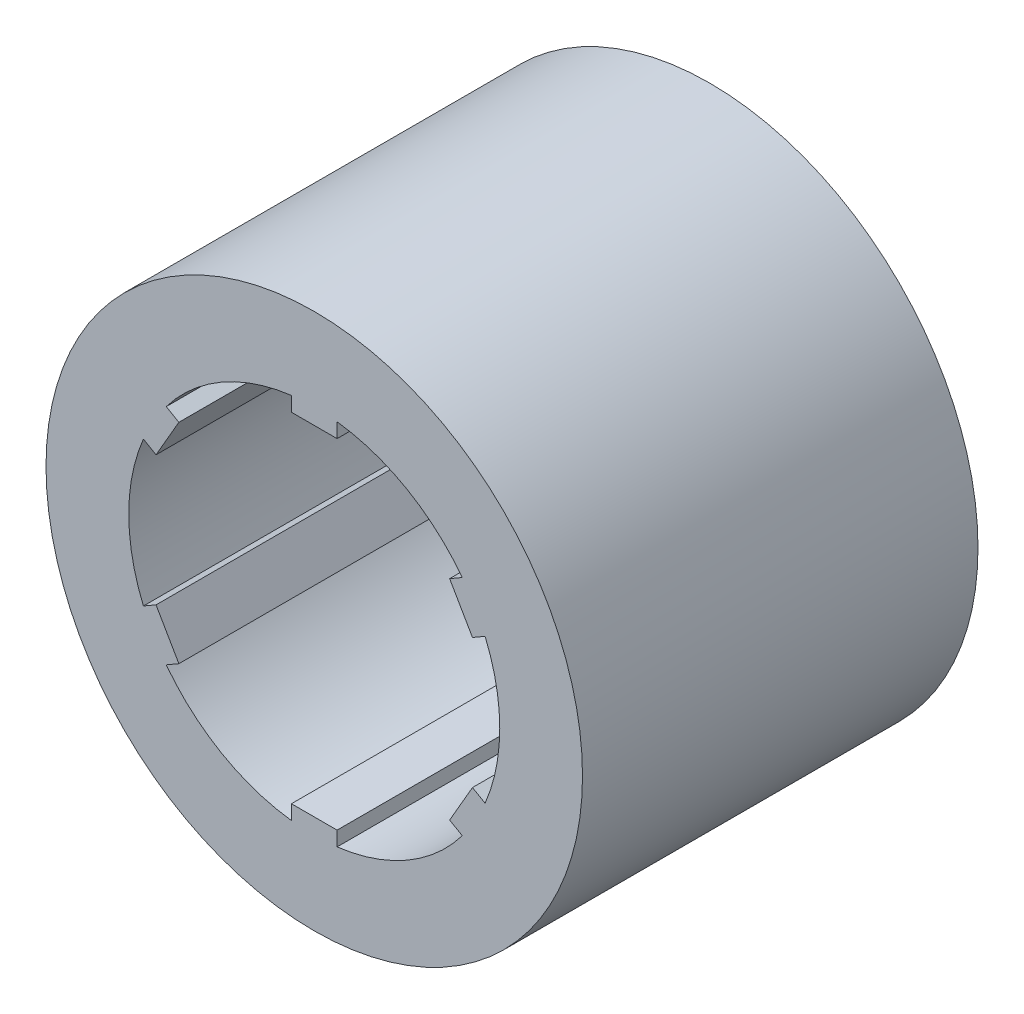
ISO-10303-21;
HEADER;
FILE_DESCRIPTION(('STEP AP214'),'2;1');
FILE_NAME('part.step','',(''),(''),'','','');
FILE_SCHEMA(('AUTOMOTIVE_DESIGN { 1 0 10303 214 1 1 1 1 }'));
ENDSEC;
DATA;
#1=APPLICATION_CONTEXT('core data for automotive mechanical design processes');
#2=APPLICATION_PROTOCOL_DEFINITION('international standard','automotive_design',2000,#1);
#3=PRODUCT_CONTEXT('',#1,'mechanical');
#4=PRODUCT('Part','Part','',(#3));
#5=PRODUCT_RELATED_PRODUCT_CATEGORY('part','',(#4));
#6=PRODUCT_DEFINITION_FORMATION('','',#4);
#7=PRODUCT_DEFINITION_CONTEXT('part definition',#1,'design');
#8=PRODUCT_DEFINITION('design','',#6,#7);
#9=PRODUCT_DEFINITION_SHAPE('','',#8);
#10=(LENGTH_UNIT() NAMED_UNIT(*) SI_UNIT(.MILLI.,.METRE.));
#11=(NAMED_UNIT(*) PLANE_ANGLE_UNIT() SI_UNIT($,.RADIAN.));
#12=(NAMED_UNIT(*) SI_UNIT($,.STERADIAN.) SOLID_ANGLE_UNIT());
#13=UNCERTAINTY_MEASURE_WITH_UNIT(LENGTH_MEASURE(1.E-05),#10,'distance_accuracy_value','');
#14=(GEOMETRIC_REPRESENTATION_CONTEXT(3) GLOBAL_UNCERTAINTY_ASSIGNED_CONTEXT((#13)) GLOBAL_UNIT_ASSIGNED_CONTEXT((#10,
#11,#12)) REPRESENTATION_CONTEXT('',''));
#15=CARTESIAN_POINT('',(0.,0.,0.));
#16=DIRECTION('',(0.,0.,1.));
#17=DIRECTION('',(1.,0.,0.));
#18=AXIS2_PLACEMENT_3D('',#15,#16,#17);
#19=CARTESIAN_POINT('',(0.267491680232823,-0.401237520349207,22.));
#20=DIRECTION('',(0.,0.,1.));
#21=DIRECTION('',(1.,0.,0.));
#22=AXIS2_PLACEMENT_3D('',#19,#20,#21);
#23=PLANE('',#22);
#24=CARTESIAN_POINT('',(0.267491680232823,-0.401237520349207,22.));
#25=DIRECTION('',(0.,0.,1.));
#26=DIRECTION('',(1.,0.,0.));
#27=AXIS2_PLACEMENT_3D('',#24,#25,#26);
#28=CIRCLE('',#27,14.9225);
#29=CARTESIAN_POINT('',(15.1899916802328,-0.401237520349207,22.));
#30=VERTEX_POINT('',#29);
#31=EDGE_CURVE('E11',#30,#30,#28,.T.);
#32=ORIENTED_EDGE('',*,*,#31,.T.);
#33=EDGE_LOOP('',(#32));
#34=FACE_BOUND('',#33,.T.);
#35=DIRECTION('',(0.866025403784438,-0.500000000000001,0.));
#36=VECTOR('',#35,1.);
#37=CARTESIAN_POINT('',(9.06889471596868,-4.01626025894532,22.));
#38=LINE('',#37,#36);
#39=CARTESIAN_POINT('',(9.06889471596868,-4.01626025894532,22.));
#40=VERTEX_POINT('',#39);
#41=CARTESIAN_POINT('',(9.77084980849768,-4.42153422057596,22.));
#42=VERTEX_POINT('',#41);
#43=EDGE_CURVE('E206',#40,#42,#38,.T.);
#44=ORIENTED_EDGE('',*,*,#43,.F.);
#45=DIRECTION('',(0.5,0.866025403784439,0.));
#46=VECTOR('',#45,1.);
#47=CARTESIAN_POINT('',(7.79889472013101,-6.21596477734844,22.));
#48=LINE('',#47,#46);
#49=CARTESIAN_POINT('',(7.79889472013101,-6.21596477734844,22.));
#50=VERTEX_POINT('',#49);
#51=EDGE_CURVE('E198',#50,#40,#48,.T.);
#52=ORIENTED_EDGE('',*,*,#51,.F.);
#53=DIRECTION('',(-0.866025403784439,0.5,0.));
#54=VECTOR('',#53,1.);
#55=CARTESIAN_POINT('',(8.50084981781817,-6.62123874195715,22.));
#56=LINE('',#55,#54);
#57=CARTESIAN_POINT('',(8.50084981781816,-6.62123874195715,22.));
#58=VERTEX_POINT('',#57);
#59=EDGE_CURVE('E262',#58,#50,#56,.T.);
#60=ORIENTED_EDGE('',*,*,#59,.F.);
#61=CARTESIAN_POINT('',(0.267491672147195,-0.401237515003277,22.));
#62=DIRECTION('',(0.,0.,1.));
#63=DIRECTION('',(1.,0.,0.));
#64=AXIS2_PLACEMENT_3D('',#61,#62,#63);
#65=CIRCLE('',#64,10.3187500026987);
#66=CARTESIAN_POINT('',(1.53749167181505,-10.6415354412864,22.));
#67=VERTEX_POINT('',#66);
#68=EDGE_CURVE('E260',#67,#58,#65,.T.);
#69=ORIENTED_EDGE('',*,*,#68,.F.);
#70=DIRECTION('',(0.,-1.,0.));
#71=VECTOR('',#70,1.);
#72=CARTESIAN_POINT('',(1.53749167181505,-9.83098751232511,22.));
#73=LINE('',#72,#71);
#74=CARTESIAN_POINT('',(1.53749167181505,-9.83098751232511,22.));
#75=VERTEX_POINT('',#74);
#76=EDGE_CURVE('E258',#75,#67,#73,.T.);
#77=ORIENTED_EDGE('',*,*,#76,.F.);
#78=DIRECTION('',(1.,0.,0.));
#79=VECTOR('',#78,1.);
#80=CARTESIAN_POINT('',(-1.00250832818495,-9.83098751232511,22.));
#81=LINE('',#80,#79);
#82=CARTESIAN_POINT('',(-1.00250832818495,-9.83098751232511,22.));
#83=VERTEX_POINT('',#82);
#84=EDGE_CURVE('E256',#83,#75,#81,.T.);
#85=ORIENTED_EDGE('',*,*,#84,.F.);
#86=DIRECTION('',(0.,1.,0.));
#87=VECTOR('',#86,1.);
#88=CARTESIAN_POINT('',(-1.00250832818495,-10.641535435592,22.));
#89=LINE('',#88,#87);
#90=CARTESIAN_POINT('',(-1.00250832818496,-10.641535435592,22.));
#91=VERTEX_POINT('',#90);
#92=EDGE_CURVE('E254',#91,#83,#89,.T.);
#93=ORIENTED_EDGE('',*,*,#92,.F.);
#94=CARTESIAN_POINT('',(0.267491673620952,-0.401237514386595,22.));
#95=DIRECTION('',(0.,0.,1.));
#96=DIRECTION('',(1.,0.,0.));
#97=AXIS2_PLACEMENT_3D('',#94,#95,#96);
#98=CIRCLE('',#97,10.3187499979227);
#99=CARTESIAN_POINT('',(-7.96586646486205,-6.62123874293196,22.));
#100=VERTEX_POINT('',#99);
#101=EDGE_CURVE('E252',#100,#91,#98,.T.);
#102=ORIENTED_EDGE('',*,*,#101,.F.);
#103=DIRECTION('',(-0.866025403784438,-0.5,0.));
#104=VECTOR('',#103,1.);
#105=CARTESIAN_POINT('',(-7.26391137134267,-6.21596478072952,22.));
#106=LINE('',#105,#104);
#107=CARTESIAN_POINT('',(-7.26391137134267,-6.21596478072952,22.));
#108=VERTEX_POINT('',#107);
#109=EDGE_CURVE('E250',#108,#100,#106,.T.);
#110=ORIENTED_EDGE('',*,*,#109,.F.);
#111=DIRECTION('',(0.5,-0.866025403784438,0.));
#112=VECTOR('',#111,1.);
#113=CARTESIAN_POINT('',(-8.53391136718035,-4.0162602623264,22.));
#114=LINE('',#113,#112);
#115=CARTESIAN_POINT('',(-8.53391136718035,-4.0162602623264,22.));
#116=VERTEX_POINT('',#115);
#117=EDGE_CURVE('E248',#116,#108,#114,.T.);
#118=ORIENTED_EDGE('',*,*,#117,.F.);
#119=DIRECTION('',(0.866025403784439,0.5,0.));
#120=VECTOR('',#119,1.);
#121=CARTESIAN_POINT('',(-9.23586646146228,-4.42153422496909,22.));
#122=LINE('',#121,#120);
#123=CARTESIAN_POINT('',(-9.23586646146228,-4.42153422496909,22.));
#124=VERTEX_POINT('',#123);
#125=EDGE_CURVE('E246',#124,#116,#122,.T.);
#126=ORIENTED_EDGE('',*,*,#125,.F.);
#127=CARTESIAN_POINT('',(0.267491678842295,-0.401237520937456,22.));
#128=DIRECTION('',(0.,0.,1.));
#129=DIRECTION('',(1.,0.,0.));
#130=AXIS2_PLACEMENT_3D('',#127,#128,#129);
#131=CIRCLE('',#130,10.3187499984902);
#132=CARTESIAN_POINT('',(-9.23586645838339,3.6190591903722,22.));
#133=VERTEX_POINT('',#132);
#134=EDGE_CURVE('E244',#133,#124,#131,.T.);
#135=ORIENTED_EDGE('',*,*,#134,.F.);
#136=DIRECTION('',(-0.866025403784439,0.5,0.));
#137=VECTOR('',#136,1.);
#138=CARTESIAN_POINT('',(-8.53391136585439,3.21378522874155,22.));
#139=LINE('',#138,#137);
#140=CARTESIAN_POINT('',(-8.53391136585439,3.21378522874155,22.));
#141=VERTEX_POINT('',#140);
#142=EDGE_CURVE('E242',#141,#133,#139,.T.);
#143=ORIENTED_EDGE('',*,*,#142,.F.);
#144=DIRECTION('',(-0.5,-0.866025403784439,0.));
#145=VECTOR('',#144,1.);
#146=CARTESIAN_POINT('',(-7.26391137001671,5.41348974714467,22.));
#147=LINE('',#146,#145);
#148=CARTESIAN_POINT('',(-7.26391137001671,5.41348974714467,22.));
#149=VERTEX_POINT('',#148);
#150=EDGE_CURVE('E240',#149,#141,#147,.T.);
#151=ORIENTED_EDGE('',*,*,#150,.F.);
#152=DIRECTION('',(0.866025403784439,-0.499999999999999,0.));
#153=VECTOR('',#152,1.);
#154=CARTESIAN_POINT('',(-7.96586646737953,5.81876371156613,22.));
#155=LINE('',#154,#153);
#156=CARTESIAN_POINT('',(-7.96586646737953,5.81876371156613,22.));
#157=VERTEX_POINT('',#156);
#158=EDGE_CURVE('E238',#157,#149,#155,.T.);
#159=ORIENTED_EDGE('',*,*,#158,.F.);
#160=CARTESIAN_POINT('',(0.267491676457188,-0.401237517815734,22.));
#161=DIRECTION('',(0.,0.,1.));
#162=DIRECTION('',(1.,0.,0.));
#163=AXIS2_PLACEMENT_3D('',#160,#161,#162);
#164=CIRCLE('',#163,10.3187500026987);
#165=CARTESIAN_POINT('',(-1.00250832321067,9.83906040846736,22.));
#166=VERTEX_POINT('',#165);
#167=EDGE_CURVE('E236',#166,#157,#164,.T.);
#168=ORIENTED_EDGE('',*,*,#167,.F.);
#169=DIRECTION('',(0.,1.,0.));
#170=VECTOR('',#169,1.);
#171=CARTESIAN_POINT('',(-1.00250832321067,9.0285124795061,22.));
#172=LINE('',#171,#170);
#173=CARTESIAN_POINT('',(-1.00250832321067,9.0285124795061,22.));
#174=VERTEX_POINT('',#173);
#175=EDGE_CURVE('E234',#174,#166,#172,.T.);
#176=ORIENTED_EDGE('',*,*,#175,.F.);
#177=DIRECTION('',(-1.,0.,0.));
#178=VECTOR('',#177,1.);
#179=CARTESIAN_POINT('',(1.53749167678933,9.0285124795061,22.));
#180=LINE('',#179,#178);
#181=CARTESIAN_POINT('',(1.53749167678933,9.0285124795061,22.));
#182=VERTEX_POINT('',#181);
#183=EDGE_CURVE('E232',#182,#174,#180,.T.);
#184=ORIENTED_EDGE('',*,*,#183,.F.);
#185=DIRECTION('',(0.,-1.,0.));
#186=VECTOR('',#185,1.);
#187=CARTESIAN_POINT('',(1.53749167678933,9.83906040303344,22.));
#188=LINE('',#187,#186);
#189=CARTESIAN_POINT('',(1.53749167678933,9.83906040303344,22.));
#190=VERTEX_POINT('',#189);
#191=EDGE_CURVE('E230',#190,#182,#188,.T.);
#192=ORIENTED_EDGE('',*,*,#191,.F.);
#193=CARTESIAN_POINT('',(0.267491677083749,-0.401237518432414,22.));
#194=DIRECTION('',(0.,0.,1.));
#195=DIRECTION('',(1.,0.,0.));
#196=AXIS2_PLACEMENT_3D('',#193,#194,#195);
#197=CIRCLE('',#196,10.3187499979227);
#198=CARTESIAN_POINT('',(8.50084981556675,5.81876371011295,22.));
#199=VERTEX_POINT('',#198);
#200=EDGE_CURVE('E228',#199,#190,#197,.T.);
#201=ORIENTED_EDGE('',*,*,#200,.F.);
#202=DIRECTION('',(0.866025403784439,0.5,0.));
#203=VECTOR('',#202,1.);
#204=CARTESIAN_POINT('',(7.79889472204737,5.4134897479105,22.));
#205=LINE('',#204,#203);
#206=CARTESIAN_POINT('',(7.79889472204737,5.4134897479105,22.));
#207=VERTEX_POINT('',#206);
#208=EDGE_CURVE('E226',#207,#199,#205,.T.);
#209=ORIENTED_EDGE('',*,*,#208,.F.);
#210=DIRECTION('',(-0.5,0.866025403784438,0.));
#211=VECTOR('',#210,1.);
#212=CARTESIAN_POINT('',(9.06889471555486,3.2137852335434,22.));
#213=LINE('',#212,#211);
#214=CARTESIAN_POINT('',(9.06889471555486,3.2137852335434,22.));
#215=VERTEX_POINT('',#214);
#216=EDGE_CURVE('E224',#215,#207,#213,.T.);
#217=ORIENTED_EDGE('',*,*,#216,.F.);
#218=DIRECTION('',(-0.866025403784439,-0.5,0.));
#219=VECTOR('',#218,1.);
#220=CARTESIAN_POINT('',(9.770849810752,3.61905919671449,22.));
#221=LINE('',#220,#219);
#222=CARTESIAN_POINT('',(9.770849810752,3.61905919671449,22.));
#223=VERTEX_POINT('',#222);
#224=EDGE_CURVE('E220',#223,#215,#221,.T.);
#225=ORIENTED_EDGE('',*,*,#224,.F.);
#226=CARTESIAN_POINT('',(0.267491671272001,-0.401237509266309,22.));
#227=DIRECTION('',(0.,0.,1.));
#228=DIRECTION('',(1.,0.,0.));
#229=AXIS2_PLACEMENT_3D('',#226,#227,#228);
#230=CIRCLE('',#229,10.3187499984902);
#231=EDGE_CURVE('E218',#42,#223,#230,.T.);
#232=ORIENTED_EDGE('',*,*,#231,.F.);
#233=EDGE_LOOP('',(#44,#52,#60,#69,#77,#85,#93,#102,#110,#118,#126,#135,#143,#151,#159,#168,
#176,#184,#192,#201,#209,#217,#225,#232));
#234=FACE_BOUND('',#233,.T.);
#235=ADVANCED_FACE('F37',(#34,#234),#23,.T.);
#236=CARTESIAN_POINT('',(0.267491680232823,-0.401237520349207,0.));
#237=DIRECTION('',(0.,0.,1.));
#238=DIRECTION('',(1.,0.,0.));
#239=AXIS2_PLACEMENT_3D('',#236,#237,#238);
#240=PLANE('',#239);
#241=CARTESIAN_POINT('',(0.267491680232823,-0.401237520349207,0.));
#242=DIRECTION('',(0.,0.,1.));
#243=DIRECTION('',(1.,0.,0.));
#244=AXIS2_PLACEMENT_3D('',#241,#242,#243);
#245=CIRCLE('',#244,14.9225);
#246=CARTESIAN_POINT('',(15.1899916802328,-0.401237520349207,0.));
#247=VERTEX_POINT('',#246);
#248=EDGE_CURVE('E41',#247,#247,#245,.T.);
#249=ORIENTED_EDGE('',*,*,#248,.F.);
#250=EDGE_LOOP('',(#249));
#251=FACE_BOUND('',#250,.T.);
#252=DIRECTION('',(0.5,0.866025403784439,0.));
#253=VECTOR('',#252,1.);
#254=CARTESIAN_POINT('',(7.79889472013101,-6.21596477734844,0.));
#255=LINE('',#254,#253);
#256=CARTESIAN_POINT('',(7.79889472013101,-6.21596477734844,0.));
#257=VERTEX_POINT('',#256);
#258=CARTESIAN_POINT('',(9.06889471596868,-4.01626025894532,0.));
#259=VERTEX_POINT('',#258);
#260=EDGE_CURVE('E60',#257,#259,#255,.T.);
#261=ORIENTED_EDGE('',*,*,#260,.T.);
#262=DIRECTION('',(0.866025403784438,-0.500000000000001,0.));
#263=VECTOR('',#262,1.);
#264=CARTESIAN_POINT('',(9.06889471596868,-4.01626025894532,0.));
#265=LINE('',#264,#263);
#266=CARTESIAN_POINT('',(9.77084980849768,-4.42153422057596,0.));
#267=VERTEX_POINT('',#266);
#268=EDGE_CURVE('E213',#259,#267,#265,.T.);
#269=ORIENTED_EDGE('',*,*,#268,.T.);
#270=CARTESIAN_POINT('',(0.267491671272001,-0.401237509266309,0.));
#271=DIRECTION('',(0.,0.,1.));
#272=DIRECTION('',(1.,0.,0.));
#273=AXIS2_PLACEMENT_3D('',#270,#271,#272);
#274=CIRCLE('',#273,10.3187499984902);
#275=CARTESIAN_POINT('',(9.770849810752,3.61905919671449,0.));
#276=VERTEX_POINT('',#275);
#277=EDGE_CURVE('E266',#267,#276,#274,.T.);
#278=ORIENTED_EDGE('',*,*,#277,.T.);
#279=DIRECTION('',(-0.866025403784439,-0.5,0.));
#280=VECTOR('',#279,1.);
#281=CARTESIAN_POINT('',(9.770849810752,3.61905919671449,0.));
#282=LINE('',#281,#280);
#283=CARTESIAN_POINT('',(9.06889471555486,3.2137852335434,0.));
#284=VERTEX_POINT('',#283);
#285=EDGE_CURVE('E269',#276,#284,#282,.T.);
#286=ORIENTED_EDGE('',*,*,#285,.T.);
#287=DIRECTION('',(-0.5,0.866025403784438,0.));
#288=VECTOR('',#287,1.);
#289=CARTESIAN_POINT('',(9.06889471555486,3.2137852335434,0.));
#290=LINE('',#289,#288);
#291=CARTESIAN_POINT('',(7.79889472204737,5.4134897479105,0.));
#292=VERTEX_POINT('',#291);
#293=EDGE_CURVE('E272',#284,#292,#290,.T.);
#294=ORIENTED_EDGE('',*,*,#293,.T.);
#295=DIRECTION('',(0.866025403784439,0.5,0.));
#296=VECTOR('',#295,1.);
#297=CARTESIAN_POINT('',(7.79889472204737,5.4134897479105,0.));
#298=LINE('',#297,#296);
#299=CARTESIAN_POINT('',(8.50084981556675,5.81876371011295,0.));
#300=VERTEX_POINT('',#299);
#301=EDGE_CURVE('E275',#292,#300,#298,.T.);
#302=ORIENTED_EDGE('',*,*,#301,.T.);
#303=CARTESIAN_POINT('',(0.267491677083749,-0.401237518432414,0.));
#304=DIRECTION('',(0.,0.,1.));
#305=DIRECTION('',(1.,0.,0.));
#306=AXIS2_PLACEMENT_3D('',#303,#304,#305);
#307=CIRCLE('',#306,10.3187499979227);
#308=CARTESIAN_POINT('',(1.53749167678933,9.83906040303344,0.));
#309=VERTEX_POINT('',#308);
#310=EDGE_CURVE('E278',#300,#309,#307,.T.);
#311=ORIENTED_EDGE('',*,*,#310,.T.);
#312=DIRECTION('',(0.,-1.,0.));
#313=VECTOR('',#312,1.);
#314=CARTESIAN_POINT('',(1.53749167678933,9.83906040303344,0.));
#315=LINE('',#314,#313);
#316=CARTESIAN_POINT('',(1.53749167678933,9.0285124795061,0.));
#317=VERTEX_POINT('',#316);
#318=EDGE_CURVE('E281',#309,#317,#315,.T.);
#319=ORIENTED_EDGE('',*,*,#318,.T.);
#320=DIRECTION('',(-1.,0.,0.));
#321=VECTOR('',#320,1.);
#322=CARTESIAN_POINT('',(1.53749167678933,9.0285124795061,0.));
#323=LINE('',#322,#321);
#324=CARTESIAN_POINT('',(-1.00250832321067,9.0285124795061,0.));
#325=VERTEX_POINT('',#324);
#326=EDGE_CURVE('E284',#317,#325,#323,.T.);
#327=ORIENTED_EDGE('',*,*,#326,.T.);
#328=DIRECTION('',(0.,1.,0.));
#329=VECTOR('',#328,1.);
#330=CARTESIAN_POINT('',(-1.00250832321067,9.0285124795061,0.));
#331=LINE('',#330,#329);
#332=CARTESIAN_POINT('',(-1.00250832321067,9.83906040846736,0.));
#333=VERTEX_POINT('',#332);
#334=EDGE_CURVE('E287',#325,#333,#331,.T.);
#335=ORIENTED_EDGE('',*,*,#334,.T.);
#336=CARTESIAN_POINT('',(0.267491676457188,-0.401237517815734,0.));
#337=DIRECTION('',(0.,0.,1.));
#338=DIRECTION('',(1.,0.,0.));
#339=AXIS2_PLACEMENT_3D('',#336,#337,#338);
#340=CIRCLE('',#339,10.3187500026987);
#341=CARTESIAN_POINT('',(-7.96586646737953,5.81876371156613,0.));
#342=VERTEX_POINT('',#341);
#343=EDGE_CURVE('E290',#333,#342,#340,.T.);
#344=ORIENTED_EDGE('',*,*,#343,.T.);
#345=DIRECTION('',(0.866025403784439,-0.499999999999999,0.));
#346=VECTOR('',#345,1.);
#347=CARTESIAN_POINT('',(-7.96586646737953,5.81876371156613,0.));
#348=LINE('',#347,#346);
#349=CARTESIAN_POINT('',(-7.26391137001671,5.41348974714467,0.));
#350=VERTEX_POINT('',#349);
#351=EDGE_CURVE('E293',#342,#350,#348,.T.);
#352=ORIENTED_EDGE('',*,*,#351,.T.);
#353=DIRECTION('',(-0.5,-0.866025403784439,0.));
#354=VECTOR('',#353,1.);
#355=CARTESIAN_POINT('',(-7.26391137001671,5.41348974714467,0.));
#356=LINE('',#355,#354);
#357=CARTESIAN_POINT('',(-8.53391136585439,3.21378522874155,0.));
#358=VERTEX_POINT('',#357);
#359=EDGE_CURVE('E296',#350,#358,#356,.T.);
#360=ORIENTED_EDGE('',*,*,#359,.T.);
#361=DIRECTION('',(-0.866025403784439,0.5,0.));
#362=VECTOR('',#361,1.);
#363=CARTESIAN_POINT('',(-8.53391136585439,3.21378522874155,0.));
#364=LINE('',#363,#362);
#365=CARTESIAN_POINT('',(-9.23586645838339,3.6190591903722,0.));
#366=VERTEX_POINT('',#365);
#367=EDGE_CURVE('E299',#358,#366,#364,.T.);
#368=ORIENTED_EDGE('',*,*,#367,.T.);
#369=CARTESIAN_POINT('',(0.267491678842295,-0.401237520937456,0.));
#370=DIRECTION('',(0.,0.,1.));
#371=DIRECTION('',(1.,0.,0.));
#372=AXIS2_PLACEMENT_3D('',#369,#370,#371);
#373=CIRCLE('',#372,10.3187499984902);
#374=CARTESIAN_POINT('',(-9.23586646146228,-4.42153422496909,0.));
#375=VERTEX_POINT('',#374);
#376=EDGE_CURVE('E302',#366,#375,#373,.T.);
#377=ORIENTED_EDGE('',*,*,#376,.T.);
#378=DIRECTION('',(0.866025403784439,0.5,0.));
#379=VECTOR('',#378,1.);
#380=CARTESIAN_POINT('',(-9.23586646146228,-4.42153422496909,0.));
#381=LINE('',#380,#379);
#382=CARTESIAN_POINT('',(-8.53391136718035,-4.0162602623264,0.));
#383=VERTEX_POINT('',#382);
#384=EDGE_CURVE('E305',#375,#383,#381,.T.);
#385=ORIENTED_EDGE('',*,*,#384,.T.);
#386=DIRECTION('',(0.5,-0.866025403784438,0.));
#387=VECTOR('',#386,1.);
#388=CARTESIAN_POINT('',(-8.53391136718035,-4.0162602623264,0.));
#389=LINE('',#388,#387);
#390=CARTESIAN_POINT('',(-7.26391137134267,-6.21596478072952,0.));
#391=VERTEX_POINT('',#390);
#392=EDGE_CURVE('E308',#383,#391,#389,.T.);
#393=ORIENTED_EDGE('',*,*,#392,.T.);
#394=DIRECTION('',(-0.866025403784438,-0.5,0.));
#395=VECTOR('',#394,1.);
#396=CARTESIAN_POINT('',(-7.26391137134267,-6.21596478072952,0.));
#397=LINE('',#396,#395);
#398=CARTESIAN_POINT('',(-7.96586646486205,-6.62123874293196,0.));
#399=VERTEX_POINT('',#398);
#400=EDGE_CURVE('E311',#391,#399,#397,.T.);
#401=ORIENTED_EDGE('',*,*,#400,.T.);
#402=CARTESIAN_POINT('',(0.267491673620952,-0.401237514386595,0.));
#403=DIRECTION('',(0.,0.,1.));
#404=DIRECTION('',(1.,0.,0.));
#405=AXIS2_PLACEMENT_3D('',#402,#403,#404);
#406=CIRCLE('',#405,10.3187499979227);
#407=CARTESIAN_POINT('',(-1.00250832818496,-10.641535435592,0.));
#408=VERTEX_POINT('',#407);
#409=EDGE_CURVE('E314',#399,#408,#406,.T.);
#410=ORIENTED_EDGE('',*,*,#409,.T.);
#411=DIRECTION('',(0.,1.,0.));
#412=VECTOR('',#411,1.);
#413=CARTESIAN_POINT('',(-1.00250832818495,-10.641535435592,0.));
#414=LINE('',#413,#412);
#415=CARTESIAN_POINT('',(-1.00250832818495,-9.83098751232511,0.));
#416=VERTEX_POINT('',#415);
#417=EDGE_CURVE('E317',#408,#416,#414,.T.);
#418=ORIENTED_EDGE('',*,*,#417,.T.);
#419=DIRECTION('',(1.,0.,0.));
#420=VECTOR('',#419,1.);
#421=CARTESIAN_POINT('',(-1.00250832818495,-9.83098751232511,0.));
#422=LINE('',#421,#420);
#423=CARTESIAN_POINT('',(1.53749167181505,-9.83098751232511,0.));
#424=VERTEX_POINT('',#423);
#425=EDGE_CURVE('E320',#416,#424,#422,.T.);
#426=ORIENTED_EDGE('',*,*,#425,.T.);
#427=DIRECTION('',(0.,-1.,0.));
#428=VECTOR('',#427,1.);
#429=CARTESIAN_POINT('',(1.53749167181505,-9.83098751232511,0.));
#430=LINE('',#429,#428);
#431=CARTESIAN_POINT('',(1.53749167181505,-10.6415354412864,0.));
#432=VERTEX_POINT('',#431);
#433=EDGE_CURVE('E323',#424,#432,#430,.T.);
#434=ORIENTED_EDGE('',*,*,#433,.T.);
#435=CARTESIAN_POINT('',(0.267491672147195,-0.401237515003277,0.));
#436=DIRECTION('',(0.,0.,1.));
#437=DIRECTION('',(1.,0.,0.));
#438=AXIS2_PLACEMENT_3D('',#435,#436,#437);
#439=CIRCLE('',#438,10.3187500026987);
#440=CARTESIAN_POINT('',(8.50084981781816,-6.62123874195715,0.));
#441=VERTEX_POINT('',#440);
#442=EDGE_CURVE('E326',#432,#441,#439,.T.);
#443=ORIENTED_EDGE('',*,*,#442,.T.);
#444=DIRECTION('',(-0.866025403784439,0.5,0.));
#445=VECTOR('',#444,1.);
#446=CARTESIAN_POINT('',(8.50084981781817,-6.62123874195715,0.));
#447=LINE('',#446,#445);
#448=EDGE_CURVE('E207',#441,#257,#447,.T.);
#449=ORIENTED_EDGE('',*,*,#448,.T.);
#450=EDGE_LOOP('',(#261,#269,#278,#286,#294,#302,#311,#319,#327,#335,#344,#352,#360,#368,#377,
#385,#393,#401,#410,#418,#426,#434,#443,#449));
#451=FACE_BOUND('',#450,.T.);
#452=ADVANCED_FACE('F379',(#251,#451),#240,.F.);
#453=CARTESIAN_POINT('',(0.267491680232823,-0.401237520349207,22.));
#454=DIRECTION('',(0.,0.,-1.));
#455=DIRECTION('',(-1.,0.,0.));
#456=AXIS2_PLACEMENT_3D('',#453,#454,#455);
#457=CYLINDRICAL_SURFACE('',#456,14.9225);
#458=ORIENTED_EDGE('',*,*,#31,.F.);
#459=EDGE_LOOP('',(#458));
#460=FACE_BOUND('',#459,.T.);
#461=ORIENTED_EDGE('',*,*,#248,.T.);
#462=EDGE_LOOP('',(#461));
#463=FACE_BOUND('',#462,.T.);
#464=ADVANCED_FACE('F39',(#460,#463),#457,.T.);
#465=CARTESIAN_POINT('',(7.79889472013101,-6.21596477734844,22.));
#466=DIRECTION('',(-0.866025403784439,0.5,0.));
#467=DIRECTION('',(-0.5,-0.866025403784439,0.));
#468=AXIS2_PLACEMENT_3D('',#465,#466,#467);
#469=PLANE('',#468);
#470=ORIENTED_EDGE('',*,*,#260,.F.);
#471=DIRECTION('',(0.,0.,-1.));
#472=VECTOR('',#471,1.);
#473=CARTESIAN_POINT('',(7.79889472013101,-6.21596477734844,22.));
#474=LINE('',#473,#472);
#475=EDGE_CURVE('E202',#50,#257,#474,.T.);
#476=ORIENTED_EDGE('',*,*,#475,.F.);
#477=ORIENTED_EDGE('',*,*,#51,.T.);
#478=DIRECTION('',(0.,0.,-1.));
#479=VECTOR('',#478,1.);
#480=CARTESIAN_POINT('',(9.06889471596868,-4.01626025894532,22.));
#481=LINE('',#480,#479);
#482=EDGE_CURVE('E201',#40,#259,#481,.T.);
#483=ORIENTED_EDGE('',*,*,#482,.T.);
#484=EDGE_LOOP('',(#470,#476,#477,#483));
#485=FACE_BOUND('',#484,.T.);
#486=ADVANCED_FACE('F200',(#485),#469,.T.);
#487=CARTESIAN_POINT('',(9.06889471596868,-4.01626025894532,22.));
#488=DIRECTION('',(0.500000000000001,0.866025403784438,0.));
#489=DIRECTION('',(-0.866025403784438,0.500000000000001,0.));
#490=AXIS2_PLACEMENT_3D('',#487,#488,#489);
#491=PLANE('',#490);
#492=ORIENTED_EDGE('',*,*,#268,.F.);
#493=ORIENTED_EDGE('',*,*,#482,.F.);
#494=ORIENTED_EDGE('',*,*,#43,.T.);
#495=DIRECTION('',(0.,0.,-1.));
#496=VECTOR('',#495,1.);
#497=CARTESIAN_POINT('',(9.77084980849768,-4.42153422057596,22.));
#498=LINE('',#497,#496);
#499=EDGE_CURVE('E214',#42,#267,#498,.T.);
#500=ORIENTED_EDGE('',*,*,#499,.T.);
#501=EDGE_LOOP('',(#492,#493,#494,#500));
#502=FACE_BOUND('',#501,.T.);
#503=ADVANCED_FACE('F210',(#502),#491,.T.);
#504=CARTESIAN_POINT('',(0.267491671272001,-0.401237509266309,22.));
#505=DIRECTION('',(0.,0.,-1.));
#506=DIRECTION('',(-1.,0.,0.));
#507=AXIS2_PLACEMENT_3D('',#504,#505,#506);
#508=CYLINDRICAL_SURFACE('',#507,10.3187499984902);
#509=ORIENTED_EDGE('',*,*,#277,.F.);
#510=ORIENTED_EDGE('',*,*,#499,.F.);
#511=ORIENTED_EDGE('',*,*,#231,.T.);
#512=DIRECTION('',(0.,0.,-1.));
#513=VECTOR('',#512,1.);
#514=CARTESIAN_POINT('',(9.770849810752,3.61905919671449,22.));
#515=LINE('',#514,#513);
#516=EDGE_CURVE('E371',#223,#276,#515,.T.);
#517=ORIENTED_EDGE('',*,*,#516,.T.);
#518=EDGE_LOOP('',(#509,#510,#511,#517));
#519=FACE_BOUND('',#518,.T.);
#520=ADVANCED_FACE('F375',(#519),#508,.F.);
#521=CARTESIAN_POINT('',(9.770849810752,3.61905919671449,22.));
#522=DIRECTION('',(0.5,-0.866025403784439,0.));
#523=DIRECTION('',(0.866025403784439,0.5,0.));
#524=AXIS2_PLACEMENT_3D('',#521,#522,#523);
#525=PLANE('',#524);
#526=ORIENTED_EDGE('',*,*,#285,.F.);
#527=ORIENTED_EDGE('',*,*,#516,.F.);
#528=ORIENTED_EDGE('',*,*,#224,.T.);
#529=DIRECTION('',(0.,0.,-1.));
#530=VECTOR('',#529,1.);
#531=CARTESIAN_POINT('',(9.06889471555486,3.2137852335434,22.));
#532=LINE('',#531,#530);
#533=EDGE_CURVE('E369',#215,#284,#532,.T.);
#534=ORIENTED_EDGE('',*,*,#533,.T.);
#535=EDGE_LOOP('',(#526,#527,#528,#534));
#536=FACE_BOUND('',#535,.T.);
#537=ADVANCED_FACE('F477',(#536),#525,.T.);
#538=CARTESIAN_POINT('',(9.06889471555486,3.2137852335434,22.));
#539=DIRECTION('',(-0.866025403784438,-0.500000000000001,0.));
#540=DIRECTION('',(0.500000000000001,-0.866025403784438,0.));
#541=AXIS2_PLACEMENT_3D('',#538,#539,#540);
#542=PLANE('',#541);
#543=ORIENTED_EDGE('',*,*,#293,.F.);
#544=ORIENTED_EDGE('',*,*,#533,.F.);
#545=ORIENTED_EDGE('',*,*,#216,.T.);
#546=DIRECTION('',(0.,0.,-1.));
#547=VECTOR('',#546,1.);
#548=CARTESIAN_POINT('',(7.79889472204737,5.4134897479105,22.));
#549=LINE('',#548,#547);
#550=EDGE_CURVE('E367',#207,#292,#549,.T.);
#551=ORIENTED_EDGE('',*,*,#550,.T.);
#552=EDGE_LOOP('',(#543,#544,#545,#551));
#553=FACE_BOUND('',#552,.T.);
#554=ADVANCED_FACE('F475',(#553),#542,.T.);
#555=CARTESIAN_POINT('',(7.79889472204737,5.4134897479105,22.));
#556=DIRECTION('',(-0.5,0.866025403784439,0.));
#557=DIRECTION('',(-0.866025403784439,-0.5,0.));
#558=AXIS2_PLACEMENT_3D('',#555,#556,#557);
#559=PLANE('',#558);
#560=ORIENTED_EDGE('',*,*,#301,.F.);
#561=ORIENTED_EDGE('',*,*,#550,.F.);
#562=ORIENTED_EDGE('',*,*,#208,.T.);
#563=DIRECTION('',(0.,0.,-1.));
#564=VECTOR('',#563,1.);
#565=CARTESIAN_POINT('',(8.50084981556675,5.81876371011295,22.));
#566=LINE('',#565,#564);
#567=EDGE_CURVE('E365',#199,#300,#566,.T.);
#568=ORIENTED_EDGE('',*,*,#567,.T.);
#569=EDGE_LOOP('',(#560,#561,#562,#568));
#570=FACE_BOUND('',#569,.T.);
#571=ADVANCED_FACE('F469',(#570),#559,.T.);
#572=CARTESIAN_POINT('',(0.267491677083749,-0.401237518432414,22.));
#573=DIRECTION('',(0.,0.,-1.));
#574=DIRECTION('',(-1.,0.,0.));
#575=AXIS2_PLACEMENT_3D('',#572,#573,#574);
#576=CYLINDRICAL_SURFACE('',#575,10.3187499979227);
#577=ORIENTED_EDGE('',*,*,#310,.F.);
#578=ORIENTED_EDGE('',*,*,#567,.F.);
#579=ORIENTED_EDGE('',*,*,#200,.T.);
#580=DIRECTION('',(0.,0.,-1.));
#581=VECTOR('',#580,1.);
#582=CARTESIAN_POINT('',(1.53749167678933,9.83906040303344,22.));
#583=LINE('',#582,#581);
#584=EDGE_CURVE('E363',#190,#309,#583,.T.);
#585=ORIENTED_EDGE('',*,*,#584,.T.);
#586=EDGE_LOOP('',(#577,#578,#579,#585));
#587=FACE_BOUND('',#586,.T.);
#588=ADVANCED_FACE('F465',(#587),#576,.F.);
#589=CARTESIAN_POINT('',(1.53749167678933,9.83906040303344,22.));
#590=DIRECTION('',(1.,0.,0.));
#591=DIRECTION('',(0.,0.,-1.));
#592=AXIS2_PLACEMENT_3D('',#589,#590,#591);
#593=PLANE('',#592);
#594=ORIENTED_EDGE('',*,*,#318,.F.);
#595=ORIENTED_EDGE('',*,*,#584,.F.);
#596=ORIENTED_EDGE('',*,*,#191,.T.);
#597=DIRECTION('',(0.,0.,-1.));
#598=VECTOR('',#597,1.);
#599=CARTESIAN_POINT('',(1.53749167678933,9.0285124795061,22.));
#600=LINE('',#599,#598);
#601=EDGE_CURVE('E361',#182,#317,#600,.T.);
#602=ORIENTED_EDGE('',*,*,#601,.T.);
#603=EDGE_LOOP('',(#594,#595,#596,#602));
#604=FACE_BOUND('',#603,.T.);
#605=ADVANCED_FACE('F462',(#604),#593,.T.);
#606=CARTESIAN_POINT('',(1.53749167678933,9.0285124795061,22.));
#607=DIRECTION('',(0.,-1.,0.));
#608=DIRECTION('',(0.,0.,-1.));
#609=AXIS2_PLACEMENT_3D('',#606,#607,#608);
#610=PLANE('',#609);
#611=ORIENTED_EDGE('',*,*,#326,.F.);
#612=ORIENTED_EDGE('',*,*,#601,.F.);
#613=ORIENTED_EDGE('',*,*,#183,.T.);
#614=DIRECTION('',(0.,0.,-1.));
#615=VECTOR('',#614,1.);
#616=CARTESIAN_POINT('',(-1.00250832321067,9.0285124795061,22.));
#617=LINE('',#616,#615);
#618=EDGE_CURVE('E359',#174,#325,#617,.T.);
#619=ORIENTED_EDGE('',*,*,#618,.T.);
#620=EDGE_LOOP('',(#611,#612,#613,#619));
#621=FACE_BOUND('',#620,.T.);
#622=ADVANCED_FACE('F454',(#621),#610,.T.);
#623=CARTESIAN_POINT('',(-1.00250832321067,9.0285124795061,22.));
#624=DIRECTION('',(-1.,0.,0.));
#625=DIRECTION('',(0.,0.,1.));
#626=AXIS2_PLACEMENT_3D('',#623,#624,#625);
#627=PLANE('',#626);
#628=ORIENTED_EDGE('',*,*,#334,.F.);
#629=ORIENTED_EDGE('',*,*,#618,.F.);
#630=ORIENTED_EDGE('',*,*,#175,.T.);
#631=DIRECTION('',(0.,0.,-1.));
#632=VECTOR('',#631,1.);
#633=CARTESIAN_POINT('',(-1.00250832321067,9.83906040846736,22.));
#634=LINE('',#633,#632);
#635=EDGE_CURVE('E357',#166,#333,#634,.T.);
#636=ORIENTED_EDGE('',*,*,#635,.T.);
#637=EDGE_LOOP('',(#628,#629,#630,#636));
#638=FACE_BOUND('',#637,.T.);
#639=ADVANCED_FACE('F450',(#638),#627,.T.);
#640=CARTESIAN_POINT('',(0.267491676457188,-0.401237517815734,22.));
#641=DIRECTION('',(0.,0.,-1.));
#642=DIRECTION('',(-1.,0.,0.));
#643=AXIS2_PLACEMENT_3D('',#640,#641,#642);
#644=CYLINDRICAL_SURFACE('',#643,10.3187500026987);
#645=ORIENTED_EDGE('',*,*,#343,.F.);
#646=ORIENTED_EDGE('',*,*,#635,.F.);
#647=ORIENTED_EDGE('',*,*,#167,.T.);
#648=DIRECTION('',(0.,0.,-1.));
#649=VECTOR('',#648,1.);
#650=CARTESIAN_POINT('',(-7.96586646737953,5.81876371156613,22.));
#651=LINE('',#650,#649);
#652=EDGE_CURVE('E355',#157,#342,#651,.T.);
#653=ORIENTED_EDGE('',*,*,#652,.T.);
#654=EDGE_LOOP('',(#645,#646,#647,#653));
#655=FACE_BOUND('',#654,.T.);
#656=ADVANCED_FACE('F447',(#655),#644,.F.);
#657=CARTESIAN_POINT('',(-7.96586646737953,5.81876371156613,22.));
#658=DIRECTION('',(0.499999999999999,0.866025403784439,0.));
#659=DIRECTION('',(-0.866025403784439,0.499999999999999,0.));
#660=AXIS2_PLACEMENT_3D('',#657,#658,#659);
#661=PLANE('',#660);
#662=ORIENTED_EDGE('',*,*,#351,.F.);
#663=ORIENTED_EDGE('',*,*,#652,.F.);
#664=ORIENTED_EDGE('',*,*,#158,.T.);
#665=DIRECTION('',(0.,0.,-1.));
#666=VECTOR('',#665,1.);
#667=CARTESIAN_POINT('',(-7.26391137001671,5.41348974714467,22.));
#668=LINE('',#667,#666);
#669=EDGE_CURVE('E353',#149,#350,#668,.T.);
#670=ORIENTED_EDGE('',*,*,#669,.T.);
#671=EDGE_LOOP('',(#662,#663,#664,#670));
#672=FACE_BOUND('',#671,.T.);
#673=ADVANCED_FACE('F439',(#672),#661,.T.);
#674=CARTESIAN_POINT('',(-7.26391137001671,5.41348974714467,22.));
#675=DIRECTION('',(0.866025403784439,-0.5,0.));
#676=DIRECTION('',(0.5,0.866025403784439,0.));
#677=AXIS2_PLACEMENT_3D('',#674,#675,#676);
#678=PLANE('',#677);
#679=ORIENTED_EDGE('',*,*,#359,.F.);
#680=ORIENTED_EDGE('',*,*,#669,.F.);
#681=ORIENTED_EDGE('',*,*,#150,.T.);
#682=DIRECTION('',(0.,0.,-1.));
#683=VECTOR('',#682,1.);
#684=CARTESIAN_POINT('',(-8.53391136585439,3.21378522874155,22.));
#685=LINE('',#684,#683);
#686=EDGE_CURVE('E351',#141,#358,#685,.T.);
#687=ORIENTED_EDGE('',*,*,#686,.T.);
#688=EDGE_LOOP('',(#679,#680,#681,#687));
#689=FACE_BOUND('',#688,.T.);
#690=ADVANCED_FACE('F435',(#689),#678,.T.);
#691=CARTESIAN_POINT('',(-8.53391136585439,3.21378522874155,22.));
#692=DIRECTION('',(-0.5,-0.866025403784439,0.));
#693=DIRECTION('',(0.866025403784439,-0.5,0.));
#694=AXIS2_PLACEMENT_3D('',#691,#692,#693);
#695=PLANE('',#694);
#696=ORIENTED_EDGE('',*,*,#367,.F.);
#697=ORIENTED_EDGE('',*,*,#686,.F.);
#698=ORIENTED_EDGE('',*,*,#142,.T.);
#699=DIRECTION('',(0.,0.,-1.));
#700=VECTOR('',#699,1.);
#701=CARTESIAN_POINT('',(-9.23586645838339,3.6190591903722,22.));
#702=LINE('',#701,#700);
#703=EDGE_CURVE('E349',#133,#366,#702,.T.);
#704=ORIENTED_EDGE('',*,*,#703,.T.);
#705=EDGE_LOOP('',(#696,#697,#698,#704));
#706=FACE_BOUND('',#705,.T.);
#707=ADVANCED_FACE('F432',(#706),#695,.T.);
#708=CARTESIAN_POINT('',(0.267491678842295,-0.401237520937456,22.));
#709=DIRECTION('',(0.,0.,-1.));
#710=DIRECTION('',(-1.,0.,0.));
#711=AXIS2_PLACEMENT_3D('',#708,#709,#710);
#712=CYLINDRICAL_SURFACE('',#711,10.3187499984902);
#713=ORIENTED_EDGE('',*,*,#376,.F.);
#714=ORIENTED_EDGE('',*,*,#703,.F.);
#715=ORIENTED_EDGE('',*,*,#134,.T.);
#716=DIRECTION('',(0.,0.,-1.));
#717=VECTOR('',#716,1.);
#718=CARTESIAN_POINT('',(-9.23586646146228,-4.42153422496909,22.));
#719=LINE('',#718,#717);
#720=EDGE_CURVE('E347',#124,#375,#719,.T.);
#721=ORIENTED_EDGE('',*,*,#720,.T.);
#722=EDGE_LOOP('',(#713,#714,#715,#721));
#723=FACE_BOUND('',#722,.T.);
#724=ADVANCED_FACE('F424',(#723),#712,.F.);
#725=CARTESIAN_POINT('',(-9.23586646146228,-4.42153422496909,22.));
#726=DIRECTION('',(-0.5,0.866025403784439,0.));
#727=DIRECTION('',(-0.866025403784439,-0.5,0.));
#728=AXIS2_PLACEMENT_3D('',#725,#726,#727);
#729=PLANE('',#728);
#730=ORIENTED_EDGE('',*,*,#384,.F.);
#731=ORIENTED_EDGE('',*,*,#720,.F.);
#732=ORIENTED_EDGE('',*,*,#125,.T.);
#733=DIRECTION('',(0.,0.,-1.));
#734=VECTOR('',#733,1.);
#735=CARTESIAN_POINT('',(-8.53391136718035,-4.0162602623264,22.));
#736=LINE('',#735,#734);
#737=EDGE_CURVE('E345',#116,#383,#736,.T.);
#738=ORIENTED_EDGE('',*,*,#737,.T.);
#739=EDGE_LOOP('',(#730,#731,#732,#738));
#740=FACE_BOUND('',#739,.T.);
#741=ADVANCED_FACE('F420',(#740),#729,.T.);
#742=CARTESIAN_POINT('',(-8.53391136718035,-4.0162602623264,22.));
#743=DIRECTION('',(0.866025403784439,0.5,0.));
#744=DIRECTION('',(-0.5,0.866025403784439,0.));
#745=AXIS2_PLACEMENT_3D('',#742,#743,#744);
#746=PLANE('',#745);
#747=ORIENTED_EDGE('',*,*,#392,.F.);
#748=ORIENTED_EDGE('',*,*,#737,.F.);
#749=ORIENTED_EDGE('',*,*,#117,.T.);
#750=DIRECTION('',(0.,0.,-1.));
#751=VECTOR('',#750,1.);
#752=CARTESIAN_POINT('',(-7.26391137134267,-6.21596478072952,22.));
#753=LINE('',#752,#751);
#754=EDGE_CURVE('E343',#108,#391,#753,.T.);
#755=ORIENTED_EDGE('',*,*,#754,.T.);
#756=EDGE_LOOP('',(#747,#748,#749,#755));
#757=FACE_BOUND('',#756,.T.);
#758=ADVANCED_FACE('F417',(#757),#746,.T.);
#759=CARTESIAN_POINT('',(-7.26391137134267,-6.21596478072952,22.));
#760=DIRECTION('',(0.500000000000001,-0.866025403784438,0.));
#761=DIRECTION('',(0.866025403784438,0.500000000000001,0.));
#762=AXIS2_PLACEMENT_3D('',#759,#760,#761);
#763=PLANE('',#762);
#764=ORIENTED_EDGE('',*,*,#400,.F.);
#765=ORIENTED_EDGE('',*,*,#754,.F.);
#766=ORIENTED_EDGE('',*,*,#109,.T.);
#767=DIRECTION('',(0.,0.,-1.));
#768=VECTOR('',#767,1.);
#769=CARTESIAN_POINT('',(-7.96586646486205,-6.62123874293196,22.));
#770=LINE('',#769,#768);
#771=EDGE_CURVE('E341',#100,#399,#770,.T.);
#772=ORIENTED_EDGE('',*,*,#771,.T.);
#773=EDGE_LOOP('',(#764,#765,#766,#772));
#774=FACE_BOUND('',#773,.T.);
#775=ADVANCED_FACE('F409',(#774),#763,.T.);
#776=CARTESIAN_POINT('',(0.267491673620952,-0.401237514386595,22.));
#777=DIRECTION('',(0.,0.,-1.));
#778=DIRECTION('',(-1.,0.,0.));
#779=AXIS2_PLACEMENT_3D('',#776,#777,#778);
#780=CYLINDRICAL_SURFACE('',#779,10.3187499979227);
#781=ORIENTED_EDGE('',*,*,#409,.F.);
#782=ORIENTED_EDGE('',*,*,#771,.F.);
#783=ORIENTED_EDGE('',*,*,#101,.T.);
#784=DIRECTION('',(0.,0.,-1.));
#785=VECTOR('',#784,1.);
#786=CARTESIAN_POINT('',(-1.00250832818496,-10.641535435592,22.));
#787=LINE('',#786,#785);
#788=EDGE_CURVE('E339',#91,#408,#787,.T.);
#789=ORIENTED_EDGE('',*,*,#788,.T.);
#790=EDGE_LOOP('',(#781,#782,#783,#789));
#791=FACE_BOUND('',#790,.T.);
#792=ADVANCED_FACE('F405',(#791),#780,.F.);
#793=CARTESIAN_POINT('',(-1.00250832818495,-10.641535435592,22.));
#794=DIRECTION('',(-1.,0.,0.));
#795=DIRECTION('',(0.,0.,1.));
#796=AXIS2_PLACEMENT_3D('',#793,#794,#795);
#797=PLANE('',#796);
#798=ORIENTED_EDGE('',*,*,#417,.F.);
#799=ORIENTED_EDGE('',*,*,#788,.F.);
#800=ORIENTED_EDGE('',*,*,#92,.T.);
#801=DIRECTION('',(0.,0.,-1.));
#802=VECTOR('',#801,1.);
#803=CARTESIAN_POINT('',(-1.00250832818495,-9.83098751232511,22.));
#804=LINE('',#803,#802);
#805=EDGE_CURVE('E337',#83,#416,#804,.T.);
#806=ORIENTED_EDGE('',*,*,#805,.T.);
#807=EDGE_LOOP('',(#798,#799,#800,#806));
#808=FACE_BOUND('',#807,.T.);
#809=ADVANCED_FACE('F402',(#808),#797,.T.);
#810=CARTESIAN_POINT('',(-1.00250832818495,-9.83098751232511,22.));
#811=DIRECTION('',(0.,1.,0.));
#812=DIRECTION('',(0.,0.,1.));
#813=AXIS2_PLACEMENT_3D('',#810,#811,#812);
#814=PLANE('',#813);
#815=ORIENTED_EDGE('',*,*,#425,.F.);
#816=ORIENTED_EDGE('',*,*,#805,.F.);
#817=ORIENTED_EDGE('',*,*,#84,.T.);
#818=DIRECTION('',(0.,0.,-1.));
#819=VECTOR('',#818,1.);
#820=CARTESIAN_POINT('',(1.53749167181505,-9.83098751232511,22.));
#821=LINE('',#820,#819);
#822=EDGE_CURVE('E335',#75,#424,#821,.T.);
#823=ORIENTED_EDGE('',*,*,#822,.T.);
#824=EDGE_LOOP('',(#815,#816,#817,#823));
#825=FACE_BOUND('',#824,.T.);
#826=ADVANCED_FACE('F394',(#825),#814,.T.);
#827=CARTESIAN_POINT('',(1.53749167181505,-9.83098751232511,22.));
#828=DIRECTION('',(1.,0.,0.));
#829=DIRECTION('',(0.,0.,-1.));
#830=AXIS2_PLACEMENT_3D('',#827,#828,#829);
#831=PLANE('',#830);
#832=ORIENTED_EDGE('',*,*,#433,.F.);
#833=ORIENTED_EDGE('',*,*,#822,.F.);
#834=ORIENTED_EDGE('',*,*,#76,.T.);
#835=DIRECTION('',(0.,0.,-1.));
#836=VECTOR('',#835,1.);
#837=CARTESIAN_POINT('',(1.53749167181505,-10.6415354412864,22.));
#838=LINE('',#837,#836);
#839=EDGE_CURVE('E333',#67,#432,#838,.T.);
#840=ORIENTED_EDGE('',*,*,#839,.T.);
#841=EDGE_LOOP('',(#832,#833,#834,#840));
#842=FACE_BOUND('',#841,.T.);
#843=ADVANCED_FACE('F390',(#842),#831,.T.);
#844=CARTESIAN_POINT('',(0.267491672147195,-0.401237515003277,22.));
#845=DIRECTION('',(0.,0.,-1.));
#846=DIRECTION('',(-1.,0.,0.));
#847=AXIS2_PLACEMENT_3D('',#844,#845,#846);
#848=CYLINDRICAL_SURFACE('',#847,10.3187500026987);
#849=ORIENTED_EDGE('',*,*,#442,.F.);
#850=ORIENTED_EDGE('',*,*,#839,.F.);
#851=ORIENTED_EDGE('',*,*,#68,.T.);
#852=DIRECTION('',(0.,0.,-1.));
#853=VECTOR('',#852,1.);
#854=CARTESIAN_POINT('',(8.50084981781816,-6.62123874195715,22.));
#855=LINE('',#854,#853);
#856=EDGE_CURVE('E52',#58,#441,#855,.T.);
#857=ORIENTED_EDGE('',*,*,#856,.T.);
#858=EDGE_LOOP('',(#849,#850,#851,#857));
#859=FACE_BOUND('',#858,.T.);
#860=ADVANCED_FACE('F387',(#859),#848,.F.);
#861=CARTESIAN_POINT('',(8.50084981781817,-6.62123874195715,22.));
#862=DIRECTION('',(-0.5,-0.866025403784439,0.));
#863=DIRECTION('',(0.866025403784439,-0.5,0.));
#864=AXIS2_PLACEMENT_3D('',#861,#862,#863);
#865=PLANE('',#864);
#866=ORIENTED_EDGE('',*,*,#448,.F.);
#867=ORIENTED_EDGE('',*,*,#856,.F.);
#868=ORIENTED_EDGE('',*,*,#59,.T.);
#869=ORIENTED_EDGE('',*,*,#475,.T.);
#870=EDGE_LOOP('',(#866,#867,#868,#869));
#871=FACE_BOUND('',#870,.T.);
#872=ADVANCED_FACE('F381',(#871),#865,.T.);
#873=CLOSED_SHELL('',(#235,#452,#464,#486,#503,#520,#537,#554,#571,#588,#605,#622,#639,#656,
#673,#690,#707,#724,#741,#758,#775,#792,#809,#826,#843,#860,#872));
#874=MANIFOLD_SOLID_BREP('B2',#873);
#875=ADVANCED_BREP_SHAPE_REPRESENTATION('',(#18,#874),#14);
#876=SHAPE_DEFINITION_REPRESENTATION(#9,#875);
ENDSEC;
END-ISO-10303-21;
